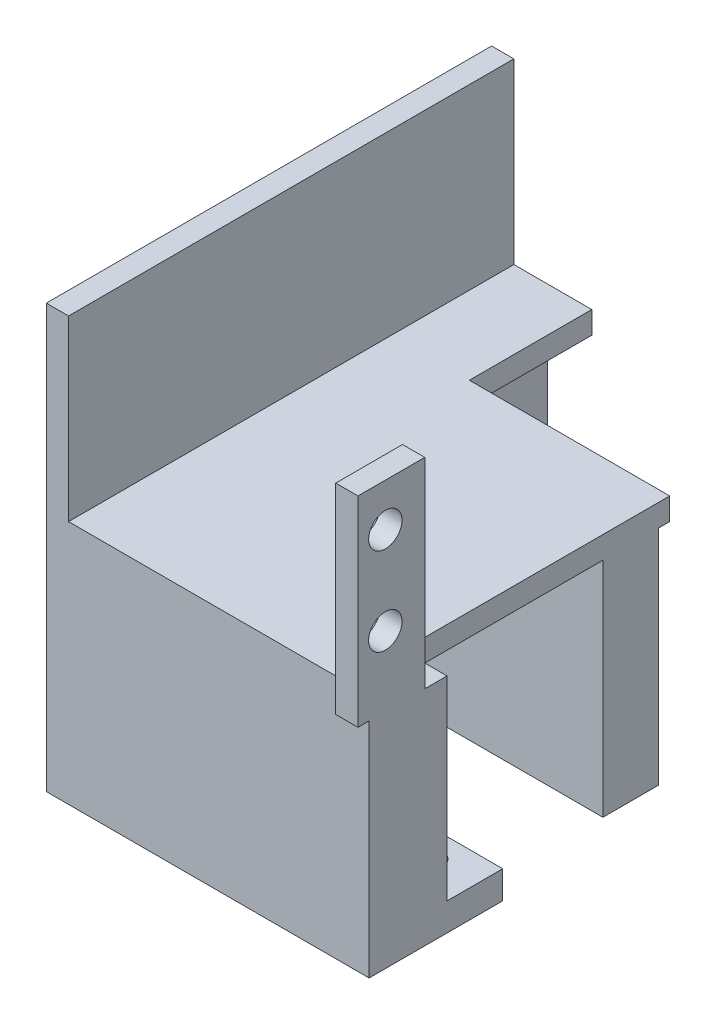
ISO-10303-21;
HEADER;
FILE_DESCRIPTION(('STEP AP214'),'2;1');
FILE_NAME('part.step','',(''),(''),'','','');
FILE_SCHEMA(('AUTOMOTIVE_DESIGN { 1 0 10303 214 1 1 1 1 }'));
ENDSEC;
DATA;
#1=APPLICATION_CONTEXT('core data for automotive mechanical design processes');
#2=APPLICATION_PROTOCOL_DEFINITION('international standard','automotive_design',2000,#1);
#3=PRODUCT_CONTEXT('',#1,'mechanical');
#4=PRODUCT('Part','Part','',(#3));
#5=PRODUCT_RELATED_PRODUCT_CATEGORY('part','',(#4));
#6=PRODUCT_DEFINITION_FORMATION('','',#4);
#7=PRODUCT_DEFINITION_CONTEXT('part definition',#1,'design');
#8=PRODUCT_DEFINITION('design','',#6,#7);
#9=PRODUCT_DEFINITION_SHAPE('','',#8);
#10=(LENGTH_UNIT() NAMED_UNIT(*) SI_UNIT(.MILLI.,.METRE.));
#11=(NAMED_UNIT(*) PLANE_ANGLE_UNIT() SI_UNIT($,.RADIAN.));
#12=(NAMED_UNIT(*) SI_UNIT($,.STERADIAN.) SOLID_ANGLE_UNIT());
#13=UNCERTAINTY_MEASURE_WITH_UNIT(LENGTH_MEASURE(1.E-05),#10,'distance_accuracy_value','');
#14=(GEOMETRIC_REPRESENTATION_CONTEXT(3) GLOBAL_UNCERTAINTY_ASSIGNED_CONTEXT((#13)) GLOBAL_UNIT_ASSIGNED_CONTEXT((#10,
#11,#12)) REPRESENTATION_CONTEXT('',''));
#15=CARTESIAN_POINT('',(0.,0.,0.));
#16=DIRECTION('',(0.,0.,1.));
#17=DIRECTION('',(1.,0.,0.));
#18=AXIS2_PLACEMENT_3D('',#15,#16,#17);
#19=CARTESIAN_POINT('',(-2.54,22.86,0.));
#20=DIRECTION('',(1.,0.,0.));
#21=DIRECTION('',(0.,0.,-1.));
#22=AXIS2_PLACEMENT_3D('',#19,#20,#21);
#23=PLANE('',#22);
#24=DIRECTION('',(0.,-1.,0.));
#25=VECTOR('',#24,1.);
#26=CARTESIAN_POINT('',(-2.54,-25.4,-39.37));
#27=LINE('',#26,#25);
#28=CARTESIAN_POINT('',(-2.54,-22.225,-39.37));
#29=VERTEX_POINT('',#28);
#30=CARTESIAN_POINT('',(-2.54,-25.4,-39.37));
#31=VERTEX_POINT('',#30);
#32=EDGE_CURVE('E259',#29,#31,#27,.T.);
#33=ORIENTED_EDGE('',*,*,#32,.F.);
#34=DIRECTION('',(0.,0.,-1.));
#35=VECTOR('',#34,1.);
#36=CARTESIAN_POINT('',(-2.54,-22.225,-29.21));
#37=LINE('',#36,#35);
#38=CARTESIAN_POINT('',(-2.54,-22.225,-29.21));
#39=VERTEX_POINT('',#38);
#40=EDGE_CURVE('E57',#39,#29,#37,.T.);
#41=ORIENTED_EDGE('',*,*,#40,.F.);
#42=DIRECTION('',(0.,1.,0.));
#43=VECTOR('',#42,1.);
#44=CARTESIAN_POINT('',(-2.54,-25.4,-29.21));
#45=LINE('',#44,#43);
#46=CARTESIAN_POINT('',(-2.54,0.,-29.21));
#47=VERTEX_POINT('',#46);
#48=EDGE_CURVE('E263',#39,#47,#45,.T.);
#49=ORIENTED_EDGE('',*,*,#48,.T.);
#50=DIRECTION('',(0.,0.,1.));
#51=VECTOR('',#50,1.);
#52=CARTESIAN_POINT('',(-2.54,0.,0.));
#53=LINE('',#52,#51);
#54=CARTESIAN_POINT('',(-2.54,0.,-8.89));
#55=VERTEX_POINT('',#54);
#56=EDGE_CURVE('E462',#47,#55,#53,.T.);
#57=ORIENTED_EDGE('',*,*,#56,.T.);
#58=DIRECTION('',(0.,1.,0.));
#59=VECTOR('',#58,1.);
#60=CARTESIAN_POINT('',(-2.54,-25.4,-8.89));
#61=LINE('',#60,#59);
#62=CARTESIAN_POINT('',(-2.54,-22.225,-8.89));
#63=VERTEX_POINT('',#62);
#64=EDGE_CURVE('E459',#63,#55,#61,.T.);
#65=ORIENTED_EDGE('',*,*,#64,.F.);
#66=DIRECTION('',(0.,0.,1.));
#67=VECTOR('',#66,1.);
#68=CARTESIAN_POINT('',(-2.54,-22.225,-15.24));
#69=LINE('',#68,#67);
#70=CARTESIAN_POINT('',(-2.54,-22.225,-15.24));
#71=VERTEX_POINT('',#70);
#72=EDGE_CURVE('E299',#71,#63,#69,.T.);
#73=ORIENTED_EDGE('',*,*,#72,.F.);
#74=DIRECTION('',(0.,1.,0.));
#75=VECTOR('',#74,1.);
#76=CARTESIAN_POINT('',(-2.54,-25.4,-15.24));
#77=LINE('',#76,#75);
#78=CARTESIAN_POINT('',(-2.54,-25.4,-15.24));
#79=VERTEX_POINT('',#78);
#80=EDGE_CURVE('E275',#79,#71,#77,.T.);
#81=ORIENTED_EDGE('',*,*,#80,.F.);
#82=DIRECTION('',(0.,0.,-1.));
#83=VECTOR('',#82,1.);
#84=CARTESIAN_POINT('',(-2.54,-25.4,0.));
#85=LINE('',#84,#83);
#86=CARTESIAN_POINT('',(-2.54,-25.4,0.));
#87=VERTEX_POINT('',#86);
#88=EDGE_CURVE('E427',#87,#79,#85,.T.);
#89=ORIENTED_EDGE('',*,*,#88,.F.);
#90=DIRECTION('',(0.,-1.,0.));
#91=VECTOR('',#90,1.);
#92=CARTESIAN_POINT('',(-2.54,22.86,0.));
#93=LINE('',#92,#91);
#94=CARTESIAN_POINT('',(-2.54,22.86,0.));
#95=VERTEX_POINT('',#94);
#96=EDGE_CURVE('E480',#95,#87,#93,.T.);
#97=ORIENTED_EDGE('',*,*,#96,.F.);
#98=DIRECTION('',(0.,0.,1.));
#99=VECTOR('',#98,1.);
#100=CARTESIAN_POINT('',(-2.54,22.86,0.));
#101=LINE('',#100,#99);
#102=CARTESIAN_POINT('',(-2.54,22.86,-50.8));
#103=VERTEX_POINT('',#102);
#104=EDGE_CURVE('E467',#103,#95,#101,.T.);
#105=ORIENTED_EDGE('',*,*,#104,.F.);
#106=DIRECTION('',(0.,1.,0.));
#107=VECTOR('',#106,1.);
#108=CARTESIAN_POINT('',(-2.54,-25.4,-50.8));
#109=LINE('',#108,#107);
#110=CARTESIAN_POINT('',(-2.54,-25.4,-50.8));
#111=VERTEX_POINT('',#110);
#112=EDGE_CURVE('E333',#111,#103,#109,.T.);
#113=ORIENTED_EDGE('',*,*,#112,.F.);
#114=DIRECTION('',(0.,0.,-1.));
#115=VECTOR('',#114,1.);
#116=CARTESIAN_POINT('',(-2.54,-25.4,-54.61));
#117=LINE('',#116,#115);
#118=EDGE_CURVE('E63',#31,#111,#117,.T.);
#119=ORIENTED_EDGE('',*,*,#118,.F.);
#120=EDGE_LOOP('',(#33,#41,#49,#57,#65,#73,#81,#89,#97,#105,#113,#119));
#121=FACE_BOUND('',#120,.T.);
#122=ADVANCED_FACE('F41',(#121),#23,.F.);
#123=CARTESIAN_POINT('',(-2.54,-25.4,-8.89));
#124=DIRECTION('',(0.,0.,1.));
#125=DIRECTION('',(1.,0.,0.));
#126=AXIS2_PLACEMENT_3D('',#123,#124,#125);
#127=PLANE('',#126);
#128=DIRECTION('',(1.,0.,0.));
#129=VECTOR('',#128,1.);
#130=CARTESIAN_POINT('',(-2.54,-22.225,-8.89));
#131=LINE('',#130,#129);
#132=CARTESIAN_POINT('',(7.62,-22.225,-8.89));
#133=VERTEX_POINT('',#132);
#134=EDGE_CURVE('E265',#63,#133,#131,.T.);
#135=ORIENTED_EDGE('',*,*,#134,.F.);
#136=ORIENTED_EDGE('',*,*,#64,.T.);
#137=DIRECTION('',(1.,0.,0.));
#138=VECTOR('',#137,1.);
#139=CARTESIAN_POINT('',(-2.54,0.,-8.89));
#140=LINE('',#139,#138);
#141=CARTESIAN_POINT('',(31.75,0.,-8.89));
#142=VERTEX_POINT('',#141);
#143=EDGE_CURVE('E442',#55,#142,#140,.T.);
#144=ORIENTED_EDGE('',*,*,#143,.T.);
#145=CARTESIAN_POINT('',(34.29,0.,-8.89));
#146=VERTEX_POINT('',#145);
#147=EDGE_CURVE('E426',#142,#146,#140,.T.);
#148=ORIENTED_EDGE('',*,*,#147,.T.);
#149=DIRECTION('',(0.,1.,0.));
#150=VECTOR('',#149,1.);
#151=CARTESIAN_POINT('',(34.29,-25.4,-8.89));
#152=LINE('',#151,#150);
#153=CARTESIAN_POINT('',(34.29,-22.225,-8.89));
#154=VERTEX_POINT('',#153);
#155=EDGE_CURVE('E456',#154,#146,#152,.T.);
#156=ORIENTED_EDGE('',*,*,#155,.F.);
#157=DIRECTION('',(1.,0.,0.));
#158=VECTOR('',#157,1.);
#159=CARTESIAN_POINT('',(34.29,-22.225,-8.89));
#160=LINE('',#159,#158);
#161=CARTESIAN_POINT('',(24.13,-22.225,-8.89));
#162=VERTEX_POINT('',#161);
#163=EDGE_CURVE('E308',#162,#154,#160,.T.);
#164=ORIENTED_EDGE('',*,*,#163,.F.);
#165=DIRECTION('',(0.,1.,0.));
#166=VECTOR('',#165,1.);
#167=CARTESIAN_POINT('',(24.13,-25.4,-8.89));
#168=LINE('',#167,#166);
#169=CARTESIAN_POINT('',(24.13,-25.4,-8.89));
#170=VERTEX_POINT('',#169);
#171=EDGE_CURVE('E302',#170,#162,#168,.T.);
#172=ORIENTED_EDGE('',*,*,#171,.F.);
#173=DIRECTION('',(1.,0.,0.));
#174=VECTOR('',#173,1.);
#175=CARTESIAN_POINT('',(-2.54,-25.4,-8.89));
#176=LINE('',#175,#174);
#177=CARTESIAN_POINT('',(7.62,-25.4,-8.89));
#178=VERTEX_POINT('',#177);
#179=EDGE_CURVE('E430',#178,#170,#176,.T.);
#180=ORIENTED_EDGE('',*,*,#179,.F.);
#181=DIRECTION('',(0.,-1.,0.));
#182=VECTOR('',#181,1.);
#183=CARTESIAN_POINT('',(7.62,-25.4,-8.89));
#184=LINE('',#183,#182);
#185=EDGE_CURVE('E269',#133,#178,#184,.T.);
#186=ORIENTED_EDGE('',*,*,#185,.F.);
#187=EDGE_LOOP('',(#135,#136,#144,#148,#156,#164,#172,#180,#186));
#188=FACE_BOUND('',#187,.T.);
#189=ADVANCED_FACE('F588',(#188),#127,.F.);
#190=CARTESIAN_POINT('',(0.,0.,0.));
#191=DIRECTION('',(0.,-1.,0.));
#192=DIRECTION('',(0.,0.,-1.));
#193=AXIS2_PLACEMENT_3D('',#190,#191,#192);
#194=PLANE('',#193);
#195=DIRECTION('',(-1.,0.,0.));
#196=VECTOR('',#195,1.);
#197=CARTESIAN_POINT('',(0.,0.,-50.8));
#198=LINE('',#197,#196);
#199=CARTESIAN_POINT('',(8.89,0.,-50.8));
#200=VERTEX_POINT('',#199);
#201=CARTESIAN_POINT('',(3.81,0.,-50.8));
#202=VERTEX_POINT('',#201);
#203=EDGE_CURVE('E348',#200,#202,#198,.T.);
#204=ORIENTED_EDGE('',*,*,#203,.F.);
#205=DIRECTION('',(0.,0.,-1.));
#206=VECTOR('',#205,1.);
#207=CARTESIAN_POINT('',(8.89,0.,-55.88));
#208=LINE('',#207,#206);
#209=CARTESIAN_POINT('',(8.89,0.,-36.83));
#210=VERTEX_POINT('',#209);
#211=EDGE_CURVE('E362',#210,#200,#208,.T.);
#212=ORIENTED_EDGE('',*,*,#211,.F.);
#213=DIRECTION('',(1.,0.,0.));
#214=VECTOR('',#213,1.);
#215=CARTESIAN_POINT('',(8.89,0.,-36.83));
#216=LINE('',#215,#214);
#217=CARTESIAN_POINT('',(31.75,0.,-36.83));
#218=VERTEX_POINT('',#217);
#219=EDGE_CURVE('E366',#210,#218,#216,.T.);
#220=ORIENTED_EDGE('',*,*,#219,.T.);
#221=DIRECTION('',(0.,0.,-1.));
#222=VECTOR('',#221,1.);
#223=CARTESIAN_POINT('',(31.75,0.,0.));
#224=LINE('',#223,#222);
#225=CARTESIAN_POINT('',(31.75,0.,-35.56));
#226=VERTEX_POINT('',#225);
#227=EDGE_CURVE('E525',#226,#218,#224,.T.);
#228=ORIENTED_EDGE('',*,*,#227,.F.);
#229=DIRECTION('',(1.,0.,0.));
#230=VECTOR('',#229,1.);
#231=CARTESIAN_POINT('',(3.81,0.,-35.56));
#232=LINE('',#231,#230);
#233=CARTESIAN_POINT('',(3.81,0.,-35.56));
#234=VERTEX_POINT('',#233);
#235=EDGE_CURVE('E392',#234,#226,#232,.T.);
#236=ORIENTED_EDGE('',*,*,#235,.F.);
#237=DIRECTION('',(0.,0.,1.));
#238=VECTOR('',#237,1.);
#239=CARTESIAN_POINT('',(3.81,0.,-54.61));
#240=LINE('',#239,#238);
#241=EDGE_CURVE('E374',#202,#234,#240,.T.);
#242=ORIENTED_EDGE('',*,*,#241,.F.);
#243=EDGE_LOOP('',(#204,#212,#220,#228,#236,#242));
#244=FACE_BOUND('',#243,.T.);
#245=ADVANCED_FACE('F603',(#244),#194,.T.);
#246=ORIENTED_EDGE('',*,*,#56,.F.);
#247=DIRECTION('',(-1.,0.,0.));
#248=VECTOR('',#247,1.);
#249=CARTESIAN_POINT('',(-2.54,0.,-29.21));
#250=LINE('',#249,#248);
#251=CARTESIAN_POINT('',(31.75,0.,-29.21));
#252=VERTEX_POINT('',#251);
#253=EDGE_CURVE('E378',#252,#47,#250,.T.);
#254=ORIENTED_EDGE('',*,*,#253,.F.);
#255=EDGE_CURVE('E543',#142,#252,#224,.T.);
#256=ORIENTED_EDGE('',*,*,#255,.F.);
#257=ORIENTED_EDGE('',*,*,#143,.F.);
#258=EDGE_LOOP('',(#246,#254,#256,#257));
#259=FACE_BOUND('',#258,.T.);
#260=ADVANCED_FACE('F578',(#259),#194,.T.);
#261=DIRECTION('',(-1.,0.,0.));
#262=VECTOR('',#261,1.);
#263=CARTESIAN_POINT('',(-2.54,0.,0.));
#264=LINE('',#263,#262);
#265=CARTESIAN_POINT('',(34.29,0.,0.));
#266=VERTEX_POINT('',#265);
#267=CARTESIAN_POINT('',(31.75,0.,0.));
#268=VERTEX_POINT('',#267);
#269=EDGE_CURVE('E431',#266,#268,#264,.T.);
#270=ORIENTED_EDGE('',*,*,#269,.F.);
#271=DIRECTION('',(0.,0.,-1.));
#272=VECTOR('',#271,1.);
#273=CARTESIAN_POINT('',(34.29,0.,1.27));
#274=LINE('',#273,#272);
#275=CARTESIAN_POINT('',(34.29,0.,1.27));
#276=VERTEX_POINT('',#275);
#277=EDGE_CURVE('E504',#276,#266,#274,.T.);
#278=ORIENTED_EDGE('',*,*,#277,.F.);
#279=DIRECTION('',(1.,0.,0.));
#280=VECTOR('',#279,1.);
#281=CARTESIAN_POINT('',(31.75,0.,1.27));
#282=LINE('',#281,#280);
#283=CARTESIAN_POINT('',(31.75,0.,1.27));
#284=VERTEX_POINT('',#283);
#285=EDGE_CURVE('E501',#284,#276,#282,.T.);
#286=ORIENTED_EDGE('',*,*,#285,.F.);
#287=DIRECTION('',(0.,0.,1.));
#288=VECTOR('',#287,1.);
#289=CARTESIAN_POINT('',(31.75,0.,1.27));
#290=LINE('',#289,#288);
#291=EDGE_CURVE('E483',#268,#284,#290,.T.);
#292=ORIENTED_EDGE('',*,*,#291,.F.);
#293=EDGE_LOOP('',(#270,#278,#286,#292));
#294=FACE_BOUND('',#293,.T.);
#295=ADVANCED_FACE('F738',(#294),#194,.T.);
#296=CARTESIAN_POINT('',(31.75,2.54,0.));
#297=DIRECTION('',(-1.,0.,0.));
#298=DIRECTION('',(0.,0.,1.));
#299=AXIS2_PLACEMENT_3D('',#296,#297,#298);
#300=PLANE('',#299);
#301=ORIENTED_EDGE('',*,*,#227,.T.);
#302=DIRECTION('',(0.,1.,0.));
#303=VECTOR('',#302,1.);
#304=CARTESIAN_POINT('',(31.75,2.54,-36.83));
#305=LINE('',#304,#303);
#306=CARTESIAN_POINT('',(31.75,2.54,-36.83));
#307=VERTEX_POINT('',#306);
#308=EDGE_CURVE('E370',#218,#307,#305,.T.);
#309=ORIENTED_EDGE('',*,*,#308,.T.);
#310=DIRECTION('',(0.,0.,-1.));
#311=VECTOR('',#310,1.);
#312=CARTESIAN_POINT('',(31.75,2.54,0.));
#313=LINE('',#312,#311);
#314=CARTESIAN_POINT('',(31.75,2.54,-6.35));
#315=VERTEX_POINT('',#314);
#316=EDGE_CURVE('E530',#315,#307,#313,.T.);
#317=ORIENTED_EDGE('',*,*,#316,.F.);
#318=DIRECTION('',(0.,-1.,0.));
#319=VECTOR('',#318,1.);
#320=CARTESIAN_POINT('',(31.75,22.86,-6.35));
#321=LINE('',#320,#319);
#322=CARTESIAN_POINT('',(31.75,0.,-6.35));
#323=VERTEX_POINT('',#322);
#324=EDGE_CURVE('E514',#315,#323,#321,.T.);
#325=ORIENTED_EDGE('',*,*,#324,.T.);
#326=EDGE_CURVE('E531',#323,#142,#224,.T.);
#327=ORIENTED_EDGE('',*,*,#326,.T.);
#328=ORIENTED_EDGE('',*,*,#255,.T.);
#329=DIRECTION('',(0.,1.,0.));
#330=VECTOR('',#329,1.);
#331=CARTESIAN_POINT('',(31.75,-25.4,-29.21));
#332=LINE('',#331,#330);
#333=CARTESIAN_POINT('',(31.75,-25.4,-29.21));
#334=VERTEX_POINT('',#333);
#335=EDGE_CURVE('E399',#334,#252,#332,.T.);
#336=ORIENTED_EDGE('',*,*,#335,.F.);
#337=DIRECTION('',(0.,0.,1.));
#338=VECTOR('',#337,1.);
#339=CARTESIAN_POINT('',(31.75,-25.4,-29.21));
#340=LINE('',#339,#338);
#341=CARTESIAN_POINT('',(31.75,-25.4,-35.56));
#342=VERTEX_POINT('',#341);
#343=EDGE_CURVE('E384',#342,#334,#340,.T.);
#344=ORIENTED_EDGE('',*,*,#343,.F.);
#345=DIRECTION('',(0.,1.,0.));
#346=VECTOR('',#345,1.);
#347=CARTESIAN_POINT('',(31.75,-25.4,-35.56));
#348=LINE('',#347,#346);
#349=EDGE_CURVE('E402',#342,#226,#348,.T.);
#350=ORIENTED_EDGE('',*,*,#349,.T.);
#351=EDGE_LOOP('',(#301,#309,#317,#325,#327,#328,#336,#344,#350));
#352=FACE_BOUND('',#351,.T.);
#353=ADVANCED_FACE('F43',(#352),#300,.F.);
#354=CARTESIAN_POINT('',(0.,2.54,0.));
#355=DIRECTION('',(0.,0.,-1.));
#356=DIRECTION('',(-1.,0.,0.));
#357=AXIS2_PLACEMENT_3D('',#354,#355,#356);
#358=PLANE('',#357);
#359=ORIENTED_EDGE('',*,*,#96,.T.);
#360=DIRECTION('',(-1.,0.,0.));
#361=VECTOR('',#360,1.);
#362=CARTESIAN_POINT('',(-2.54,-25.4,0.));
#363=LINE('',#362,#361);
#364=CARTESIAN_POINT('',(34.29,-25.4,0.));
#365=VERTEX_POINT('',#364);
#366=EDGE_CURVE('E437',#365,#87,#363,.T.);
#367=ORIENTED_EDGE('',*,*,#366,.F.);
#368=DIRECTION('',(0.,1.,0.));
#369=VECTOR('',#368,1.);
#370=CARTESIAN_POINT('',(34.29,-25.4,0.));
#371=LINE('',#370,#369);
#372=EDGE_CURVE('E441',#365,#266,#371,.T.);
#373=ORIENTED_EDGE('',*,*,#372,.T.);
#374=ORIENTED_EDGE('',*,*,#269,.T.);
#375=DIRECTION('',(0.,-1.,0.));
#376=VECTOR('',#375,1.);
#377=CARTESIAN_POINT('',(31.75,2.54,0.));
#378=LINE('',#377,#376);
#379=CARTESIAN_POINT('',(31.75,2.54,0.));
#380=VERTEX_POINT('',#379);
#381=EDGE_CURVE('E540',#380,#268,#378,.T.);
#382=ORIENTED_EDGE('',*,*,#381,.F.);
#383=DIRECTION('',(1.,0.,0.));
#384=VECTOR('',#383,1.);
#385=CARTESIAN_POINT('',(0.,2.54,0.));
#386=LINE('',#385,#384);
#387=CARTESIAN_POINT('',(0.,2.54,0.));
#388=VERTEX_POINT('',#387);
#389=EDGE_CURVE('E536',#388,#380,#386,.T.);
#390=ORIENTED_EDGE('',*,*,#389,.F.);
#391=DIRECTION('',(0.,-1.,0.));
#392=VECTOR('',#391,1.);
#393=CARTESIAN_POINT('',(0.,22.86,0.));
#394=LINE('',#393,#392);
#395=CARTESIAN_POINT('',(0.,22.86,0.));
#396=VERTEX_POINT('',#395);
#397=EDGE_CURVE('E473',#396,#388,#394,.T.);
#398=ORIENTED_EDGE('',*,*,#397,.F.);
#399=DIRECTION('',(1.,0.,0.));
#400=VECTOR('',#399,1.);
#401=CARTESIAN_POINT('',(0.,22.86,0.));
#402=LINE('',#401,#400);
#403=EDGE_CURVE('E470',#95,#396,#402,.T.);
#404=ORIENTED_EDGE('',*,*,#403,.F.);
#405=EDGE_LOOP('',(#359,#367,#373,#374,#382,#390,#398,#404));
#406=FACE_BOUND('',#405,.T.);
#407=ADVANCED_FACE('F736',(#406),#358,.F.);
#408=CARTESIAN_POINT('',(0.,2.54,0.));
#409=DIRECTION('',(0.,-1.,0.));
#410=DIRECTION('',(0.,0.,-1.));
#411=AXIS2_PLACEMENT_3D('',#408,#409,#410);
#412=PLANE('',#411);
#413=DIRECTION('',(0.,0.,-1.));
#414=VECTOR('',#413,1.);
#415=CARTESIAN_POINT('',(8.89,2.54,0.));
#416=LINE('',#415,#414);
#417=CARTESIAN_POINT('',(8.89,2.54,-36.83));
#418=VERTEX_POINT('',#417);
#419=CARTESIAN_POINT('',(8.89,2.54,-50.8));
#420=VERTEX_POINT('',#419);
#421=EDGE_CURVE('E546',#418,#420,#416,.T.);
#422=ORIENTED_EDGE('',*,*,#421,.T.);
#423=DIRECTION('',(-1.,0.,0.));
#424=VECTOR('',#423,1.);
#425=CARTESIAN_POINT('',(0.,2.54,-50.8));
#426=LINE('',#425,#424);
#427=CARTESIAN_POINT('',(0.,2.54,-50.8));
#428=VERTEX_POINT('',#427);
#429=EDGE_CURVE('E341',#420,#428,#426,.T.);
#430=ORIENTED_EDGE('',*,*,#429,.T.);
#431=DIRECTION('',(0.,0.,-1.));
#432=VECTOR('',#431,1.);
#433=CARTESIAN_POINT('',(0.,2.54,0.));
#434=LINE('',#433,#432);
#435=EDGE_CURVE('E526',#388,#428,#434,.T.);
#436=ORIENTED_EDGE('',*,*,#435,.F.);
#437=ORIENTED_EDGE('',*,*,#389,.T.);
#438=EDGE_CURVE('E532',#380,#315,#313,.T.);
#439=ORIENTED_EDGE('',*,*,#438,.T.);
#440=ORIENTED_EDGE('',*,*,#316,.T.);
#441=DIRECTION('',(-1.,0.,0.));
#442=VECTOR('',#441,1.);
#443=CARTESIAN_POINT('',(0.,2.54,-36.83));
#444=LINE('',#443,#442);
#445=EDGE_CURVE('E50',#307,#418,#444,.T.);
#446=ORIENTED_EDGE('',*,*,#445,.T.);
#447=EDGE_LOOP('',(#422,#430,#436,#437,#439,#440,#446));
#448=FACE_BOUND('',#447,.T.);
#449=ADVANCED_FACE('F553',(#448),#412,.F.);
#450=CARTESIAN_POINT('',(31.75,22.86,1.27));
#451=DIRECTION('',(1.,0.,0.));
#452=DIRECTION('',(0.,0.,-1.));
#453=AXIS2_PLACEMENT_3D('',#450,#451,#452);
#454=PLANE('',#453);
#455=CARTESIAN_POINT('',(31.75,7.96784031875419,-1.84999999999764));
#456=DIRECTION('',(1.,0.,0.));
#457=DIRECTION('',(0.,0.,-1.));
#458=AXIS2_PLACEMENT_3D('',#455,#456,#457);
#459=CIRCLE('',#458,1.9049999999594);
#460=CARTESIAN_POINT('',(31.75,7.96784031875419,-3.75499999995704));
#461=VERTEX_POINT('',#460);
#462=EDGE_CURVE('E414',#461,#461,#459,.F.);
#463=ORIENTED_EDGE('',*,*,#462,.F.);
#464=EDGE_LOOP('',(#463));
#465=FACE_BOUND('',#464,.T.);
#466=CARTESIAN_POINT('',(31.75,17.9678403187542,-1.84999999999764));
#467=DIRECTION('',(1.,0.,0.));
#468=DIRECTION('',(0.,0.,-1.));
#469=AXIS2_PLACEMENT_3D('',#466,#467,#468);
#470=CIRCLE('',#469,1.9049999999594);
#471=CARTESIAN_POINT('',(31.75,17.9678403187542,-3.75499999995703));
#472=VERTEX_POINT('',#471);
#473=EDGE_CURVE('E422',#472,#472,#470,.F.);
#474=ORIENTED_EDGE('',*,*,#473,.F.);
#475=EDGE_LOOP('',(#474));
#476=FACE_BOUND('',#475,.T.);
#477=ORIENTED_EDGE('',*,*,#438,.F.);
#478=ORIENTED_EDGE('',*,*,#381,.T.);
#479=ORIENTED_EDGE('',*,*,#291,.T.);
#480=DIRECTION('',(0.,-1.,0.));
#481=VECTOR('',#480,1.);
#482=CARTESIAN_POINT('',(31.75,22.86,1.27));
#483=LINE('',#482,#481);
#484=CARTESIAN_POINT('',(31.75,22.86,1.27));
#485=VERTEX_POINT('',#484);
#486=EDGE_CURVE('E521',#485,#284,#483,.T.);
#487=ORIENTED_EDGE('',*,*,#486,.F.);
#488=DIRECTION('',(0.,0.,1.));
#489=VECTOR('',#488,1.);
#490=CARTESIAN_POINT('',(31.75,22.86,1.27));
#491=LINE('',#490,#489);
#492=CARTESIAN_POINT('',(31.75,22.86,-6.35));
#493=VERTEX_POINT('',#492);
#494=EDGE_CURVE('E484',#493,#485,#491,.T.);
#495=ORIENTED_EDGE('',*,*,#494,.F.);
#496=EDGE_CURVE('E498',#493,#315,#321,.T.);
#497=ORIENTED_EDGE('',*,*,#496,.T.);
#498=EDGE_LOOP('',(#477,#478,#479,#487,#495,#497));
#499=FACE_BOUND('',#498,.T.);
#500=ADVANCED_FACE('F729',(#465,#476,#499),#454,.F.);
#501=CARTESIAN_POINT('',(31.75,22.86,1.27));
#502=DIRECTION('',(0.,0.,-1.));
#503=DIRECTION('',(-1.,0.,0.));
#504=AXIS2_PLACEMENT_3D('',#501,#502,#503);
#505=PLANE('',#504);
#506=ORIENTED_EDGE('',*,*,#285,.T.);
#507=DIRECTION('',(0.,-1.,0.));
#508=VECTOR('',#507,1.);
#509=CARTESIAN_POINT('',(34.29,22.86,1.27));
#510=LINE('',#509,#508);
#511=CARTESIAN_POINT('',(34.29,22.86,1.27));
#512=VERTEX_POINT('',#511);
#513=EDGE_CURVE('E517',#512,#276,#510,.T.);
#514=ORIENTED_EDGE('',*,*,#513,.F.);
#515=DIRECTION('',(1.,0.,0.));
#516=VECTOR('',#515,1.);
#517=CARTESIAN_POINT('',(31.75,22.86,1.27));
#518=LINE('',#517,#516);
#519=EDGE_CURVE('E488',#485,#512,#518,.T.);
#520=ORIENTED_EDGE('',*,*,#519,.F.);
#521=ORIENTED_EDGE('',*,*,#486,.T.);
#522=EDGE_LOOP('',(#506,#514,#520,#521));
#523=FACE_BOUND('',#522,.T.);
#524=ADVANCED_FACE('F725',(#523),#505,.F.);
#525=CARTESIAN_POINT('',(34.29,22.86,1.27));
#526=DIRECTION('',(-1.,0.,0.));
#527=DIRECTION('',(0.,0.,1.));
#528=AXIS2_PLACEMENT_3D('',#525,#526,#527);
#529=PLANE('',#528);
#530=CARTESIAN_POINT('',(34.29,7.96784031875419,-1.84999999999764));
#531=DIRECTION('',(1.,0.,0.));
#532=DIRECTION('',(0.,0.,-1.));
#533=AXIS2_PLACEMENT_3D('',#530,#531,#532);
#534=CIRCLE('',#533,1.9049999999594);
#535=CARTESIAN_POINT('',(34.29,7.96784031875419,-3.75499999995704));
#536=VERTEX_POINT('',#535);
#537=EDGE_CURVE('E410',#536,#536,#534,.T.);
#538=ORIENTED_EDGE('',*,*,#537,.F.);
#539=EDGE_LOOP('',(#538));
#540=FACE_BOUND('',#539,.T.);
#541=CARTESIAN_POINT('',(34.29,17.9678403187542,-1.84999999999764));
#542=DIRECTION('',(1.,0.,0.));
#543=DIRECTION('',(0.,0.,-1.));
#544=AXIS2_PLACEMENT_3D('',#541,#542,#543);
#545=CIRCLE('',#544,1.9049999999594);
#546=CARTESIAN_POINT('',(34.29,17.9678403187542,-3.75499999995703));
#547=VERTEX_POINT('',#546);
#548=EDGE_CURVE('E418',#547,#547,#545,.T.);
#549=ORIENTED_EDGE('',*,*,#548,.F.);
#550=EDGE_LOOP('',(#549));
#551=FACE_BOUND('',#550,.T.);
#552=ORIENTED_EDGE('',*,*,#277,.T.);
#553=ORIENTED_EDGE('',*,*,#372,.F.);
#554=DIRECTION('',(0.,0.,1.));
#555=VECTOR('',#554,1.);
#556=CARTESIAN_POINT('',(34.29,-25.4,0.));
#557=LINE('',#556,#555);
#558=CARTESIAN_POINT('',(34.29,-25.4,-15.24));
#559=VERTEX_POINT('',#558);
#560=EDGE_CURVE('E434',#559,#365,#557,.T.);
#561=ORIENTED_EDGE('',*,*,#560,.F.);
#562=DIRECTION('',(0.,-1.,0.));
#563=VECTOR('',#562,1.);
#564=CARTESIAN_POINT('',(34.29,-25.4,-15.24));
#565=LINE('',#564,#563);
#566=CARTESIAN_POINT('',(34.29,-22.225,-15.24));
#567=VERTEX_POINT('',#566);
#568=EDGE_CURVE('E303',#567,#559,#565,.T.);
#569=ORIENTED_EDGE('',*,*,#568,.F.);
#570=DIRECTION('',(0.,0.,1.));
#571=VECTOR('',#570,1.);
#572=CARTESIAN_POINT('',(34.29,-22.225,-15.24));
#573=LINE('',#572,#571);
#574=EDGE_CURVE('E317',#567,#154,#573,.T.);
#575=ORIENTED_EDGE('',*,*,#574,.T.);
#576=ORIENTED_EDGE('',*,*,#155,.T.);
#577=DIRECTION('',(0.,0.,1.));
#578=VECTOR('',#577,1.);
#579=CARTESIAN_POINT('',(34.29,0.,0.));
#580=LINE('',#579,#578);
#581=CARTESIAN_POINT('',(34.29,0.,-6.35));
#582=VERTEX_POINT('',#581);
#583=EDGE_CURVE('E446',#146,#582,#580,.T.);
#584=ORIENTED_EDGE('',*,*,#583,.T.);
#585=DIRECTION('',(0.,-1.,0.));
#586=VECTOR('',#585,1.);
#587=CARTESIAN_POINT('',(34.29,22.86,-6.35));
#588=LINE('',#587,#586);
#589=CARTESIAN_POINT('',(34.29,22.86,-6.35));
#590=VERTEX_POINT('',#589);
#591=EDGE_CURVE('E513',#590,#582,#588,.T.);
#592=ORIENTED_EDGE('',*,*,#591,.F.);
#593=DIRECTION('',(0.,0.,-1.));
#594=VECTOR('',#593,1.);
#595=CARTESIAN_POINT('',(34.29,22.86,1.27));
#596=LINE('',#595,#594);
#597=EDGE_CURVE('E492',#512,#590,#596,.T.);
#598=ORIENTED_EDGE('',*,*,#597,.F.);
#599=ORIENTED_EDGE('',*,*,#513,.T.);
#600=EDGE_LOOP('',(#552,#553,#561,#569,#575,#576,#584,#592,#598,#599));
#601=FACE_BOUND('',#600,.T.);
#602=ADVANCED_FACE('F669',(#540,#551,#601),#529,.F.);
#603=CARTESIAN_POINT('',(31.75,22.86,-6.35));
#604=DIRECTION('',(0.,0.,1.));
#605=DIRECTION('',(1.,0.,0.));
#606=AXIS2_PLACEMENT_3D('',#603,#604,#605);
#607=PLANE('',#606);
#608=DIRECTION('',(-1.,0.,0.));
#609=VECTOR('',#608,1.);
#610=CARTESIAN_POINT('',(31.75,0.,-6.35));
#611=LINE('',#610,#609);
#612=EDGE_CURVE('E489',#582,#323,#611,.T.);
#613=ORIENTED_EDGE('',*,*,#612,.T.);
#614=ORIENTED_EDGE('',*,*,#324,.F.);
#615=ORIENTED_EDGE('',*,*,#496,.F.);
#616=DIRECTION('',(-1.,0.,0.));
#617=VECTOR('',#616,1.);
#618=CARTESIAN_POINT('',(31.75,22.86,-6.35));
#619=LINE('',#618,#617);
#620=EDGE_CURVE('E495',#590,#493,#619,.T.);
#621=ORIENTED_EDGE('',*,*,#620,.F.);
#622=ORIENTED_EDGE('',*,*,#591,.T.);
#623=EDGE_LOOP('',(#613,#614,#615,#621,#622));
#624=FACE_BOUND('',#623,.T.);
#625=ADVANCED_FACE('F719',(#624),#607,.F.);
#626=CARTESIAN_POINT('',(0.,22.86,0.));
#627=DIRECTION('',(0.,-1.,0.));
#628=DIRECTION('',(0.,0.,-1.));
#629=AXIS2_PLACEMENT_3D('',#626,#627,#628);
#630=PLANE('',#629);
#631=ORIENTED_EDGE('',*,*,#494,.T.);
#632=ORIENTED_EDGE('',*,*,#519,.T.);
#633=ORIENTED_EDGE('',*,*,#597,.T.);
#634=ORIENTED_EDGE('',*,*,#620,.T.);
#635=EDGE_LOOP('',(#631,#632,#633,#634));
#636=FACE_BOUND('',#635,.T.);
#637=ADVANCED_FACE('F715',(#636),#630,.F.);
#638=CARTESIAN_POINT('',(0.,22.86,0.));
#639=DIRECTION('',(-1.,0.,0.));
#640=DIRECTION('',(0.,0.,1.));
#641=AXIS2_PLACEMENT_3D('',#638,#639,#640);
#642=PLANE('',#641);
#643=ORIENTED_EDGE('',*,*,#435,.T.);
#644=DIRECTION('',(0.,1.,0.));
#645=VECTOR('',#644,1.);
#646=CARTESIAN_POINT('',(0.,22.86,-50.8));
#647=LINE('',#646,#645);
#648=CARTESIAN_POINT('',(0.,22.86,-50.8));
#649=VERTEX_POINT('',#648);
#650=EDGE_CURVE('E355',#428,#649,#647,.T.);
#651=ORIENTED_EDGE('',*,*,#650,.T.);
#652=DIRECTION('',(0.,0.,-1.));
#653=VECTOR('',#652,1.);
#654=CARTESIAN_POINT('',(0.,22.86,0.));
#655=LINE('',#654,#653);
#656=EDGE_CURVE('E463',#396,#649,#655,.T.);
#657=ORIENTED_EDGE('',*,*,#656,.F.);
#658=ORIENTED_EDGE('',*,*,#397,.T.);
#659=EDGE_LOOP('',(#643,#651,#657,#658));
#660=FACE_BOUND('',#659,.T.);
#661=ADVANCED_FACE('F712',(#660),#642,.F.);
#662=CARTESIAN_POINT('',(0.,22.86,0.));
#663=DIRECTION('',(0.,1.,0.));
#664=DIRECTION('',(0.,0.,1.));
#665=AXIS2_PLACEMENT_3D('',#662,#663,#664);
#666=PLANE('',#665);
#667=DIRECTION('',(-1.,0.,0.));
#668=VECTOR('',#667,1.);
#669=CARTESIAN_POINT('',(22.86,22.86,-50.8));
#670=LINE('',#669,#668);
#671=EDGE_CURVE('E337',#649,#103,#670,.T.);
#672=ORIENTED_EDGE('',*,*,#671,.T.);
#673=ORIENTED_EDGE('',*,*,#104,.T.);
#674=ORIENTED_EDGE('',*,*,#403,.T.);
#675=ORIENTED_EDGE('',*,*,#656,.T.);
#676=EDGE_LOOP('',(#672,#673,#674,#675));
#677=FACE_BOUND('',#676,.T.);
#678=ADVANCED_FACE('F711',(#677),#666,.T.);
#679=CARTESIAN_POINT('',(0.,-25.4,0.));
#680=DIRECTION('',(0.,-1.,0.));
#681=DIRECTION('',(0.,0.,-1.));
#682=AXIS2_PLACEMENT_3D('',#679,#680,#681);
#683=PLANE('',#682);
#684=CARTESIAN_POINT('',(29.21,-25.4,-12.065));
#685=DIRECTION('',(0.,1.,0.));
#686=DIRECTION('',(0.,0.,1.));
#687=AXIS2_PLACEMENT_3D('',#684,#685,#686);
#688=CIRCLE('',#687,1.4224);
#689=CARTESIAN_POINT('',(29.21,-25.4,-10.6426));
#690=VERTEX_POINT('',#689);
#691=EDGE_CURVE('E618',#690,#690,#688,.T.);
#692=ORIENTED_EDGE('',*,*,#691,.T.);
#693=EDGE_LOOP('',(#692));
#694=FACE_BOUND('',#693,.T.);
#695=CARTESIAN_POINT('',(2.54,-25.4,-12.065));
#696=DIRECTION('',(0.,1.,0.));
#697=DIRECTION('',(0.,0.,1.));
#698=AXIS2_PLACEMENT_3D('',#695,#696,#697);
#699=CIRCLE('',#698,1.4224);
#700=CARTESIAN_POINT('',(2.54,-25.4,-10.6426));
#701=VERTEX_POINT('',#700);
#702=EDGE_CURVE('E634',#701,#701,#699,.T.);
#703=ORIENTED_EDGE('',*,*,#702,.T.);
#704=EDGE_LOOP('',(#703));
#705=FACE_BOUND('',#704,.T.);
#706=ORIENTED_EDGE('',*,*,#88,.T.);
#707=DIRECTION('',(-1.,0.,0.));
#708=VECTOR('',#707,1.);
#709=CARTESIAN_POINT('',(-2.54,-25.4,-15.24));
#710=LINE('',#709,#708);
#711=CARTESIAN_POINT('',(7.62,-25.4,-15.24));
#712=VERTEX_POINT('',#711);
#713=EDGE_CURVE('E285',#712,#79,#710,.T.);
#714=ORIENTED_EDGE('',*,*,#713,.F.);
#715=DIRECTION('',(0.,0.,1.));
#716=VECTOR('',#715,1.);
#717=CARTESIAN_POINT('',(7.62,-25.4,-15.24));
#718=LINE('',#717,#716);
#719=EDGE_CURVE('E288',#712,#178,#718,.T.);
#720=ORIENTED_EDGE('',*,*,#719,.T.);
#721=ORIENTED_EDGE('',*,*,#179,.T.);
#722=DIRECTION('',(0.,0.,1.));
#723=VECTOR('',#722,1.);
#724=CARTESIAN_POINT('',(24.13,-25.4,-15.24));
#725=LINE('',#724,#723);
#726=CARTESIAN_POINT('',(24.13,-25.4,-15.24));
#727=VERTEX_POINT('',#726);
#728=EDGE_CURVE('E329',#727,#170,#725,.T.);
#729=ORIENTED_EDGE('',*,*,#728,.F.);
#730=DIRECTION('',(-1.,0.,0.));
#731=VECTOR('',#730,1.);
#732=CARTESIAN_POINT('',(34.29,-25.4,-15.24));
#733=LINE('',#732,#731);
#734=EDGE_CURVE('E307',#559,#727,#733,.T.);
#735=ORIENTED_EDGE('',*,*,#734,.F.);
#736=ORIENTED_EDGE('',*,*,#560,.T.);
#737=ORIENTED_EDGE('',*,*,#366,.T.);
#738=EDGE_LOOP('',(#706,#714,#720,#721,#729,#735,#736,#737));
#739=FACE_BOUND('',#738,.T.);
#740=ADVANCED_FACE('F646',(#694,#705,#739),#683,.T.);
#741=CARTESIAN_POINT('',(0.,0.,0.));
#742=DIRECTION('',(0.,-1.,0.));
#743=DIRECTION('',(0.,0.,-1.));
#744=AXIS2_PLACEMENT_3D('',#741,#742,#743);
#745=PLANE('',#744);
#746=ORIENTED_EDGE('',*,*,#326,.F.);
#747=ORIENTED_EDGE('',*,*,#612,.F.);
#748=ORIENTED_EDGE('',*,*,#583,.F.);
#749=ORIENTED_EDGE('',*,*,#147,.F.);
#750=EDGE_LOOP('',(#746,#747,#748,#749));
#751=FACE_BOUND('',#750,.T.);
#752=ADVANCED_FACE('F582',(#751),#745,.F.);
#753=CARTESIAN_POINT('',(26.3618463274733,17.9678403187542,-1.84999999999764));
#754=DIRECTION('',(1.,0.,0.));
#755=DIRECTION('',(0.,0.,-1.));
#756=AXIS2_PLACEMENT_3D('',#753,#754,#755);
#757=CYLINDRICAL_SURFACE('',#756,1.9049999999594);
#758=ORIENTED_EDGE('',*,*,#473,.T.);
#759=EDGE_LOOP('',(#758));
#760=FACE_BOUND('',#759,.T.);
#761=ORIENTED_EDGE('',*,*,#548,.T.);
#762=EDGE_LOOP('',(#761));
#763=FACE_BOUND('',#762,.T.);
#764=ADVANCED_FACE('F787',(#760,#763),#757,.F.);
#765=CARTESIAN_POINT('',(26.3618463274733,7.96784031875419,-1.84999999999764));
#766=DIRECTION('',(1.,0.,0.));
#767=DIRECTION('',(0.,0.,-1.));
#768=AXIS2_PLACEMENT_3D('',#765,#766,#767);
#769=CYLINDRICAL_SURFACE('',#768,1.9049999999594);
#770=ORIENTED_EDGE('',*,*,#462,.T.);
#771=EDGE_LOOP('',(#770));
#772=FACE_BOUND('',#771,.T.);
#773=ORIENTED_EDGE('',*,*,#537,.T.);
#774=EDGE_LOOP('',(#773));
#775=FACE_BOUND('',#774,.T.);
#776=ADVANCED_FACE('F784',(#772,#775),#769,.F.);
#777=CARTESIAN_POINT('',(3.81,-25.4,-54.61));
#778=DIRECTION('',(-1.,0.,0.));
#779=DIRECTION('',(0.,0.,1.));
#780=AXIS2_PLACEMENT_3D('',#777,#778,#779);
#781=PLANE('',#780);
#782=DIRECTION('',(0.,0.,1.));
#783=VECTOR('',#782,1.);
#784=CARTESIAN_POINT('',(3.81,-25.4,-54.61));
#785=LINE('',#784,#783);
#786=CARTESIAN_POINT('',(3.81,-25.4,-50.8));
#787=VERTEX_POINT('',#786);
#788=CARTESIAN_POINT('',(3.81,-25.4,-35.56));
#789=VERTEX_POINT('',#788);
#790=EDGE_CURVE('E377',#787,#789,#785,.T.);
#791=ORIENTED_EDGE('',*,*,#790,.F.);
#792=DIRECTION('',(0.,1.,0.));
#793=VECTOR('',#792,1.);
#794=CARTESIAN_POINT('',(3.81,-25.4,-50.8));
#795=LINE('',#794,#793);
#796=EDGE_CURVE('E351',#787,#202,#795,.T.);
#797=ORIENTED_EDGE('',*,*,#796,.T.);
#798=ORIENTED_EDGE('',*,*,#241,.T.);
#799=DIRECTION('',(0.,1.,0.));
#800=VECTOR('',#799,1.);
#801=CARTESIAN_POINT('',(3.81,-25.4,-35.56));
#802=LINE('',#801,#800);
#803=EDGE_CURVE('E406',#789,#234,#802,.T.);
#804=ORIENTED_EDGE('',*,*,#803,.F.);
#805=EDGE_LOOP('',(#791,#797,#798,#804));
#806=FACE_BOUND('',#805,.T.);
#807=ADVANCED_FACE('F606',(#806),#781,.F.);
#808=CARTESIAN_POINT('',(3.81,-25.4,-35.56));
#809=DIRECTION('',(0.,0.,1.));
#810=DIRECTION('',(1.,0.,0.));
#811=AXIS2_PLACEMENT_3D('',#808,#809,#810);
#812=PLANE('',#811);
#813=ORIENTED_EDGE('',*,*,#235,.T.);
#814=ORIENTED_EDGE('',*,*,#349,.F.);
#815=DIRECTION('',(1.,0.,0.));
#816=VECTOR('',#815,1.);
#817=CARTESIAN_POINT('',(3.81,-25.4,-35.56));
#818=LINE('',#817,#816);
#819=EDGE_CURVE('E381',#789,#342,#818,.T.);
#820=ORIENTED_EDGE('',*,*,#819,.F.);
#821=ORIENTED_EDGE('',*,*,#803,.T.);
#822=EDGE_LOOP('',(#813,#814,#820,#821));
#823=FACE_BOUND('',#822,.T.);
#824=ADVANCED_FACE('F600',(#823),#812,.F.);
#825=CARTESIAN_POINT('',(-2.54,-25.4,-29.21));
#826=DIRECTION('',(0.,0.,-1.));
#827=DIRECTION('',(-1.,0.,0.));
#828=AXIS2_PLACEMENT_3D('',#825,#826,#827);
#829=PLANE('',#828);
#830=ORIENTED_EDGE('',*,*,#253,.T.);
#831=ORIENTED_EDGE('',*,*,#48,.F.);
#832=DIRECTION('',(1.,0.,0.));
#833=VECTOR('',#832,1.);
#834=CARTESIAN_POINT('',(-8.89,-22.225,-29.21));
#835=LINE('',#834,#833);
#836=CARTESIAN_POINT('',(-8.89,-22.225,-29.21));
#837=VERTEX_POINT('',#836);
#838=EDGE_CURVE('E242',#837,#39,#835,.T.);
#839=ORIENTED_EDGE('',*,*,#838,.F.);
#840=DIRECTION('',(0.,1.,0.));
#841=VECTOR('',#840,1.);
#842=CARTESIAN_POINT('',(-8.89,-25.4,-29.21));
#843=LINE('',#842,#841);
#844=CARTESIAN_POINT('',(-8.89,-25.4,-29.21));
#845=VERTEX_POINT('',#844);
#846=EDGE_CURVE('E249',#845,#837,#843,.T.);
#847=ORIENTED_EDGE('',*,*,#846,.F.);
#848=DIRECTION('',(-1.,0.,0.));
#849=VECTOR('',#848,1.);
#850=CARTESIAN_POINT('',(1.40371894030977,-25.4,-29.21));
#851=LINE('',#850,#849);
#852=EDGE_CURVE('E387',#334,#845,#851,.T.);
#853=ORIENTED_EDGE('',*,*,#852,.F.);
#854=ORIENTED_EDGE('',*,*,#335,.T.);
#855=EDGE_LOOP('',(#830,#831,#839,#847,#853,#854));
#856=FACE_BOUND('',#855,.T.);
#857=ADVANCED_FACE('F262',(#856),#829,.F.);
#858=CARTESIAN_POINT('',(0.,-25.4,0.));
#859=DIRECTION('',(0.,1.,0.));
#860=DIRECTION('',(0.,0.,1.));
#861=AXIS2_PLACEMENT_3D('',#858,#859,#860);
#862=PLANE('',#861);
#863=CARTESIAN_POINT('',(-5.715,-25.4,-34.29));
#864=DIRECTION('',(0.,1.,0.));
#865=DIRECTION('',(0.,0.,1.));
#866=AXIS2_PLACEMENT_3D('',#863,#864,#865);
#867=CIRCLE('',#866,1.4224);
#868=CARTESIAN_POINT('',(-5.715,-25.4,-32.8676));
#869=VERTEX_POINT('',#868);
#870=EDGE_CURVE('E626',#869,#869,#867,.T.);
#871=ORIENTED_EDGE('',*,*,#870,.T.);
#872=EDGE_LOOP('',(#871));
#873=FACE_BOUND('',#872,.T.);
#874=ORIENTED_EDGE('',*,*,#852,.T.);
#875=DIRECTION('',(0.,0.,1.));
#876=VECTOR('',#875,1.);
#877=CARTESIAN_POINT('',(-8.89,-25.4,-29.21));
#878=LINE('',#877,#876);
#879=CARTESIAN_POINT('',(-8.89,-25.4,-39.37));
#880=VERTEX_POINT('',#879);
#881=EDGE_CURVE('E255',#880,#845,#878,.T.);
#882=ORIENTED_EDGE('',*,*,#881,.F.);
#883=DIRECTION('',(1.,0.,0.));
#884=VECTOR('',#883,1.);
#885=CARTESIAN_POINT('',(-8.89,-25.4,-39.37));
#886=LINE('',#885,#884);
#887=EDGE_CURVE('E271',#880,#31,#886,.T.);
#888=ORIENTED_EDGE('',*,*,#887,.T.);
#889=ORIENTED_EDGE('',*,*,#118,.T.);
#890=DIRECTION('',(-1.,0.,0.));
#891=VECTOR('',#890,1.);
#892=CARTESIAN_POINT('',(22.86,-25.4,-50.8));
#893=LINE('',#892,#891);
#894=EDGE_CURVE('E336',#787,#111,#893,.T.);
#895=ORIENTED_EDGE('',*,*,#894,.F.);
#896=ORIENTED_EDGE('',*,*,#790,.T.);
#897=ORIENTED_EDGE('',*,*,#819,.T.);
#898=ORIENTED_EDGE('',*,*,#343,.T.);
#899=EDGE_LOOP('',(#874,#882,#888,#889,#895,#896,#897,#898));
#900=FACE_BOUND('',#899,.T.);
#901=ADVANCED_FACE('F593',(#873,#900),#862,.F.);
#902=CARTESIAN_POINT('',(8.89,22.86,-36.83));
#903=DIRECTION('',(0.,0.,1.));
#904=DIRECTION('',(1.,0.,0.));
#905=AXIS2_PLACEMENT_3D('',#902,#903,#904);
#906=PLANE('',#905);
#907=ORIENTED_EDGE('',*,*,#219,.F.);
#908=DIRECTION('',(0.,-1.,0.));
#909=VECTOR('',#908,1.);
#910=CARTESIAN_POINT('',(8.89,22.86,-36.83));
#911=LINE('',#910,#909);
#912=EDGE_CURVE('E359',#418,#210,#911,.T.);
#913=ORIENTED_EDGE('',*,*,#912,.F.);
#914=ORIENTED_EDGE('',*,*,#445,.F.);
#915=ORIENTED_EDGE('',*,*,#308,.F.);
#916=EDGE_LOOP('',(#907,#913,#914,#915));
#917=FACE_BOUND('',#916,.T.);
#918=ADVANCED_FACE('F558',(#917),#906,.F.);
#919=CARTESIAN_POINT('',(8.89,0.,0.));
#920=DIRECTION('',(-1.,0.,0.));
#921=DIRECTION('',(0.,0.,1.));
#922=AXIS2_PLACEMENT_3D('',#919,#920,#921);
#923=PLANE('',#922);
#924=ORIENTED_EDGE('',*,*,#211,.T.);
#925=DIRECTION('',(0.,1.,0.));
#926=VECTOR('',#925,1.);
#927=CARTESIAN_POINT('',(8.89,0.,-50.8));
#928=LINE('',#927,#926);
#929=EDGE_CURVE('E11',#200,#420,#928,.T.);
#930=ORIENTED_EDGE('',*,*,#929,.T.);
#931=ORIENTED_EDGE('',*,*,#421,.F.);
#932=ORIENTED_EDGE('',*,*,#912,.T.);
#933=EDGE_LOOP('',(#924,#930,#931,#932));
#934=FACE_BOUND('',#933,.T.);
#935=ADVANCED_FACE('F763',(#934),#923,.F.);
#936=CARTESIAN_POINT('',(22.86,-25.4,-50.8));
#937=DIRECTION('',(0.,0.,1.));
#938=DIRECTION('',(1.,0.,0.));
#939=AXIS2_PLACEMENT_3D('',#936,#937,#938);
#940=PLANE('',#939);
#941=ORIENTED_EDGE('',*,*,#429,.F.);
#942=ORIENTED_EDGE('',*,*,#929,.F.);
#943=ORIENTED_EDGE('',*,*,#203,.T.);
#944=ORIENTED_EDGE('',*,*,#796,.F.);
#945=ORIENTED_EDGE('',*,*,#894,.T.);
#946=ORIENTED_EDGE('',*,*,#112,.T.);
#947=ORIENTED_EDGE('',*,*,#671,.F.);
#948=ORIENTED_EDGE('',*,*,#650,.F.);
#949=EDGE_LOOP('',(#941,#942,#943,#944,#945,#946,#947,#948));
#950=FACE_BOUND('',#949,.T.);
#951=ADVANCED_FACE('F608',(#950),#940,.F.);
#952=CARTESIAN_POINT('',(24.13,-25.4,-15.24));
#953=DIRECTION('',(1.,0.,0.));
#954=DIRECTION('',(0.,0.,-1.));
#955=AXIS2_PLACEMENT_3D('',#952,#953,#954);
#956=PLANE('',#955);
#957=ORIENTED_EDGE('',*,*,#171,.T.);
#958=DIRECTION('',(0.,0.,1.));
#959=VECTOR('',#958,1.);
#960=CARTESIAN_POINT('',(24.13,-22.225,-15.24));
#961=LINE('',#960,#959);
#962=CARTESIAN_POINT('',(24.13,-22.225,-15.24));
#963=VERTEX_POINT('',#962);
#964=EDGE_CURVE('E325',#963,#162,#961,.T.);
#965=ORIENTED_EDGE('',*,*,#964,.F.);
#966=DIRECTION('',(0.,1.,0.));
#967=VECTOR('',#966,1.);
#968=CARTESIAN_POINT('',(24.13,-25.4,-15.24));
#969=LINE('',#968,#967);
#970=EDGE_CURVE('E311',#727,#963,#969,.T.);
#971=ORIENTED_EDGE('',*,*,#970,.F.);
#972=ORIENTED_EDGE('',*,*,#728,.T.);
#973=EDGE_LOOP('',(#957,#965,#971,#972));
#974=FACE_BOUND('',#973,.T.);
#975=ADVANCED_FACE('F660',(#974),#956,.F.);
#976=CARTESIAN_POINT('',(34.29,-22.225,-15.24));
#977=DIRECTION('',(0.,-1.,0.));
#978=DIRECTION('',(0.,0.,-1.));
#979=AXIS2_PLACEMENT_3D('',#976,#977,#978);
#980=PLANE('',#979);
#981=CARTESIAN_POINT('',(29.21,-22.225,-12.065));
#982=DIRECTION('',(0.,1.,0.));
#983=DIRECTION('',(0.,0.,1.));
#984=AXIS2_PLACEMENT_3D('',#981,#982,#983);
#985=CIRCLE('',#984,1.4224);
#986=CARTESIAN_POINT('',(29.21,-22.225,-10.6426));
#987=VERTEX_POINT('',#986);
#988=EDGE_CURVE('E638',#987,#987,#985,.T.);
#989=ORIENTED_EDGE('',*,*,#988,.F.);
#990=EDGE_LOOP('',(#989));
#991=FACE_BOUND('',#990,.T.);
#992=ORIENTED_EDGE('',*,*,#163,.T.);
#993=ORIENTED_EDGE('',*,*,#574,.F.);
#994=DIRECTION('',(1.,0.,0.));
#995=VECTOR('',#994,1.);
#996=CARTESIAN_POINT('',(34.29,-22.225,-15.24));
#997=LINE('',#996,#995);
#998=EDGE_CURVE('E314',#963,#567,#997,.T.);
#999=ORIENTED_EDGE('',*,*,#998,.F.);
#1000=ORIENTED_EDGE('',*,*,#964,.T.);
#1001=EDGE_LOOP('',(#992,#993,#999,#1000));
#1002=FACE_BOUND('',#1001,.T.);
#1003=ADVANCED_FACE('F656',(#991,#1002),#980,.F.);
#1004=CARTESIAN_POINT('',(0.,0.,-15.24));
#1005=DIRECTION('',(0.,0.,1.));
#1006=DIRECTION('',(1.,0.,0.));
#1007=AXIS2_PLACEMENT_3D('',#1004,#1005,#1006);
#1008=PLANE('',#1007);
#1009=ORIENTED_EDGE('',*,*,#568,.T.);
#1010=ORIENTED_EDGE('',*,*,#734,.T.);
#1011=ORIENTED_EDGE('',*,*,#970,.T.);
#1012=ORIENTED_EDGE('',*,*,#998,.T.);
#1013=EDGE_LOOP('',(#1009,#1010,#1011,#1012));
#1014=FACE_BOUND('',#1013,.T.);
#1015=ADVANCED_FACE('F659',(#1014),#1008,.F.);
#1016=CARTESIAN_POINT('',(-2.54,-22.225,-15.24));
#1017=DIRECTION('',(0.,-1.,0.));
#1018=DIRECTION('',(0.,0.,-1.));
#1019=AXIS2_PLACEMENT_3D('',#1016,#1017,#1018);
#1020=PLANE('',#1019);
#1021=CARTESIAN_POINT('',(2.54,-22.225,-12.065));
#1022=DIRECTION('',(0.,1.,0.));
#1023=DIRECTION('',(0.,0.,1.));
#1024=AXIS2_PLACEMENT_3D('',#1021,#1022,#1023);
#1025=CIRCLE('',#1024,1.4224);
#1026=CARTESIAN_POINT('',(2.54,-22.225,-10.6426));
#1027=VERTEX_POINT('',#1026);
#1028=EDGE_CURVE('E630',#1027,#1027,#1025,.T.);
#1029=ORIENTED_EDGE('',*,*,#1028,.F.);
#1030=EDGE_LOOP('',(#1029));
#1031=FACE_BOUND('',#1030,.T.);
#1032=ORIENTED_EDGE('',*,*,#134,.T.);
#1033=DIRECTION('',(0.,0.,1.));
#1034=VECTOR('',#1033,1.);
#1035=CARTESIAN_POINT('',(7.62,-22.225,-15.24));
#1036=LINE('',#1035,#1034);
#1037=CARTESIAN_POINT('',(7.62,-22.225,-15.24));
#1038=VERTEX_POINT('',#1037);
#1039=EDGE_CURVE('E295',#1038,#133,#1036,.T.);
#1040=ORIENTED_EDGE('',*,*,#1039,.F.);
#1041=DIRECTION('',(1.,0.,0.));
#1042=VECTOR('',#1041,1.);
#1043=CARTESIAN_POINT('',(-2.54,-22.225,-15.24));
#1044=LINE('',#1043,#1042);
#1045=EDGE_CURVE('E279',#71,#1038,#1044,.T.);
#1046=ORIENTED_EDGE('',*,*,#1045,.F.);
#1047=ORIENTED_EDGE('',*,*,#72,.T.);
#1048=EDGE_LOOP('',(#1032,#1040,#1046,#1047));
#1049=FACE_BOUND('',#1048,.T.);
#1050=ADVANCED_FACE('F685',(#1031,#1049),#1020,.F.);
#1051=CARTESIAN_POINT('',(7.62,-25.4,-15.24));
#1052=DIRECTION('',(-1.,0.,0.));
#1053=DIRECTION('',(0.,0.,1.));
#1054=AXIS2_PLACEMENT_3D('',#1051,#1052,#1053);
#1055=PLANE('',#1054);
#1056=ORIENTED_EDGE('',*,*,#185,.T.);
#1057=ORIENTED_EDGE('',*,*,#719,.F.);
#1058=DIRECTION('',(0.,-1.,0.));
#1059=VECTOR('',#1058,1.);
#1060=CARTESIAN_POINT('',(7.62,-25.4,-15.24));
#1061=LINE('',#1060,#1059);
#1062=EDGE_CURVE('E282',#1038,#712,#1061,.T.);
#1063=ORIENTED_EDGE('',*,*,#1062,.F.);
#1064=ORIENTED_EDGE('',*,*,#1039,.T.);
#1065=EDGE_LOOP('',(#1056,#1057,#1063,#1064));
#1066=FACE_BOUND('',#1065,.T.);
#1067=ADVANCED_FACE('F682',(#1066),#1055,.F.);
#1068=CARTESIAN_POINT('',(0.,0.,-15.24));
#1069=DIRECTION('',(0.,0.,-1.));
#1070=DIRECTION('',(-1.,0.,0.));
#1071=AXIS2_PLACEMENT_3D('',#1068,#1069,#1070);
#1072=PLANE('',#1071);
#1073=ORIENTED_EDGE('',*,*,#80,.T.);
#1074=ORIENTED_EDGE('',*,*,#1045,.T.);
#1075=ORIENTED_EDGE('',*,*,#1062,.T.);
#1076=ORIENTED_EDGE('',*,*,#713,.T.);
#1077=EDGE_LOOP('',(#1073,#1074,#1075,#1076));
#1078=FACE_BOUND('',#1077,.T.);
#1079=ADVANCED_FACE('F690',(#1078),#1072,.T.);
#1080=CARTESIAN_POINT('',(-8.89,-22.225,-29.21));
#1081=DIRECTION('',(0.,-1.,0.));
#1082=DIRECTION('',(0.,0.,-1.));
#1083=AXIS2_PLACEMENT_3D('',#1080,#1081,#1082);
#1084=PLANE('',#1083);
#1085=CARTESIAN_POINT('',(-5.715,-22.225,-34.29));
#1086=DIRECTION('',(0.,1.,0.));
#1087=DIRECTION('',(0.,0.,1.));
#1088=AXIS2_PLACEMENT_3D('',#1085,#1086,#1087);
#1089=CIRCLE('',#1088,1.4224);
#1090=CARTESIAN_POINT('',(-5.715,-22.225,-32.8676));
#1091=VERTEX_POINT('',#1090);
#1092=EDGE_CURVE('E622',#1091,#1091,#1089,.T.);
#1093=ORIENTED_EDGE('',*,*,#1092,.F.);
#1094=EDGE_LOOP('',(#1093));
#1095=FACE_BOUND('',#1094,.T.);
#1096=ORIENTED_EDGE('',*,*,#40,.T.);
#1097=DIRECTION('',(1.,0.,0.));
#1098=VECTOR('',#1097,1.);
#1099=CARTESIAN_POINT('',(-8.89,-22.225,-39.37));
#1100=LINE('',#1099,#1098);
#1101=CARTESIAN_POINT('',(-8.89,-22.225,-39.37));
#1102=VERTEX_POINT('',#1101);
#1103=EDGE_CURVE('E244',#1102,#29,#1100,.T.);
#1104=ORIENTED_EDGE('',*,*,#1103,.F.);
#1105=DIRECTION('',(0.,0.,-1.));
#1106=VECTOR('',#1105,1.);
#1107=CARTESIAN_POINT('',(-8.89,-22.225,-29.21));
#1108=LINE('',#1107,#1106);
#1109=EDGE_CURVE('E238',#837,#1102,#1108,.T.);
#1110=ORIENTED_EDGE('',*,*,#1109,.F.);
#1111=ORIENTED_EDGE('',*,*,#838,.T.);
#1112=EDGE_LOOP('',(#1096,#1104,#1110,#1111));
#1113=FACE_BOUND('',#1112,.T.);
#1114=ADVANCED_FACE('F240',(#1095,#1113),#1084,.F.);
#1115=CARTESIAN_POINT('',(-8.89,-25.4,-39.37));
#1116=DIRECTION('',(0.,0.,1.));
#1117=DIRECTION('',(1.,0.,0.));
#1118=AXIS2_PLACEMENT_3D('',#1115,#1116,#1117);
#1119=PLANE('',#1118);
#1120=ORIENTED_EDGE('',*,*,#32,.T.);
#1121=ORIENTED_EDGE('',*,*,#887,.F.);
#1122=DIRECTION('',(0.,-1.,0.));
#1123=VECTOR('',#1122,1.);
#1124=CARTESIAN_POINT('',(-8.89,-25.4,-39.37));
#1125=LINE('',#1124,#1123);
#1126=EDGE_CURVE('E248',#1102,#880,#1125,.T.);
#1127=ORIENTED_EDGE('',*,*,#1126,.F.);
#1128=ORIENTED_EDGE('',*,*,#1103,.T.);
#1129=EDGE_LOOP('',(#1120,#1121,#1127,#1128));
#1130=FACE_BOUND('',#1129,.T.);
#1131=ADVANCED_FACE('F697',(#1130),#1119,.F.);
#1132=CARTESIAN_POINT('',(-8.89,0.,0.));
#1133=DIRECTION('',(-1.,0.,0.));
#1134=DIRECTION('',(0.,0.,1.));
#1135=AXIS2_PLACEMENT_3D('',#1132,#1133,#1134);
#1136=PLANE('',#1135);
#1137=ORIENTED_EDGE('',*,*,#846,.T.);
#1138=ORIENTED_EDGE('',*,*,#1109,.T.);
#1139=ORIENTED_EDGE('',*,*,#1126,.T.);
#1140=ORIENTED_EDGE('',*,*,#881,.T.);
#1141=EDGE_LOOP('',(#1137,#1138,#1139,#1140));
#1142=FACE_BOUND('',#1141,.T.);
#1143=ADVANCED_FACE('F253',(#1142),#1136,.T.);
#1144=CARTESIAN_POINT('',(-5.715,-25.4,-34.29));
#1145=DIRECTION('',(0.,1.,0.));
#1146=DIRECTION('',(0.,0.,1.));
#1147=AXIS2_PLACEMENT_3D('',#1144,#1145,#1146);
#1148=CYLINDRICAL_SURFACE('',#1147,1.4224);
#1149=ORIENTED_EDGE('',*,*,#870,.F.);
#1150=EDGE_LOOP('',(#1149));
#1151=FACE_BOUND('',#1150,.T.);
#1152=ORIENTED_EDGE('',*,*,#1092,.T.);
#1153=EDGE_LOOP('',(#1152));
#1154=FACE_BOUND('',#1153,.T.);
#1155=ADVANCED_FACE('F921',(#1151,#1154),#1148,.F.);
#1156=CARTESIAN_POINT('',(2.54,-25.4,-12.065));
#1157=DIRECTION('',(0.,1.,0.));
#1158=DIRECTION('',(0.,0.,1.));
#1159=AXIS2_PLACEMENT_3D('',#1156,#1157,#1158);
#1160=CYLINDRICAL_SURFACE('',#1159,1.4224);
#1161=ORIENTED_EDGE('',*,*,#702,.F.);
#1162=EDGE_LOOP('',(#1161));
#1163=FACE_BOUND('',#1162,.T.);
#1164=ORIENTED_EDGE('',*,*,#1028,.T.);
#1165=EDGE_LOOP('',(#1164));
#1166=FACE_BOUND('',#1165,.T.);
#1167=ADVANCED_FACE('F652',(#1163,#1166),#1160,.F.);
#1168=CARTESIAN_POINT('',(29.21,-25.4,-12.065));
#1169=DIRECTION('',(0.,1.,0.));
#1170=DIRECTION('',(0.,0.,1.));
#1171=AXIS2_PLACEMENT_3D('',#1168,#1169,#1170);
#1172=CYLINDRICAL_SURFACE('',#1171,1.4224);
#1173=ORIENTED_EDGE('',*,*,#691,.F.);
#1174=EDGE_LOOP('',(#1173));
#1175=FACE_BOUND('',#1174,.T.);
#1176=ORIENTED_EDGE('',*,*,#988,.T.);
#1177=EDGE_LOOP('',(#1176));
#1178=FACE_BOUND('',#1177,.T.);
#1179=ADVANCED_FACE('F649',(#1175,#1178),#1172,.F.);
#1180=CLOSED_SHELL('',(#122,#189,#245,#260,#295,#353,#407,#449,#500,#524,#602,#625,#637,#661,
#678,#740,#752,#764,#776,#807,#824,#857,#901,#918,#935,#951,#975,#1003,#1015,#1050,#1067,#1079,
#1114,#1131,#1143,#1155,#1167,#1179));
#1181=MANIFOLD_SOLID_BREP('B2',#1180);
#1182=ADVANCED_BREP_SHAPE_REPRESENTATION('',(#18,#1181),#14);
#1183=SHAPE_DEFINITION_REPRESENTATION(#9,#1182);
ENDSEC;
END-ISO-10303-21;
